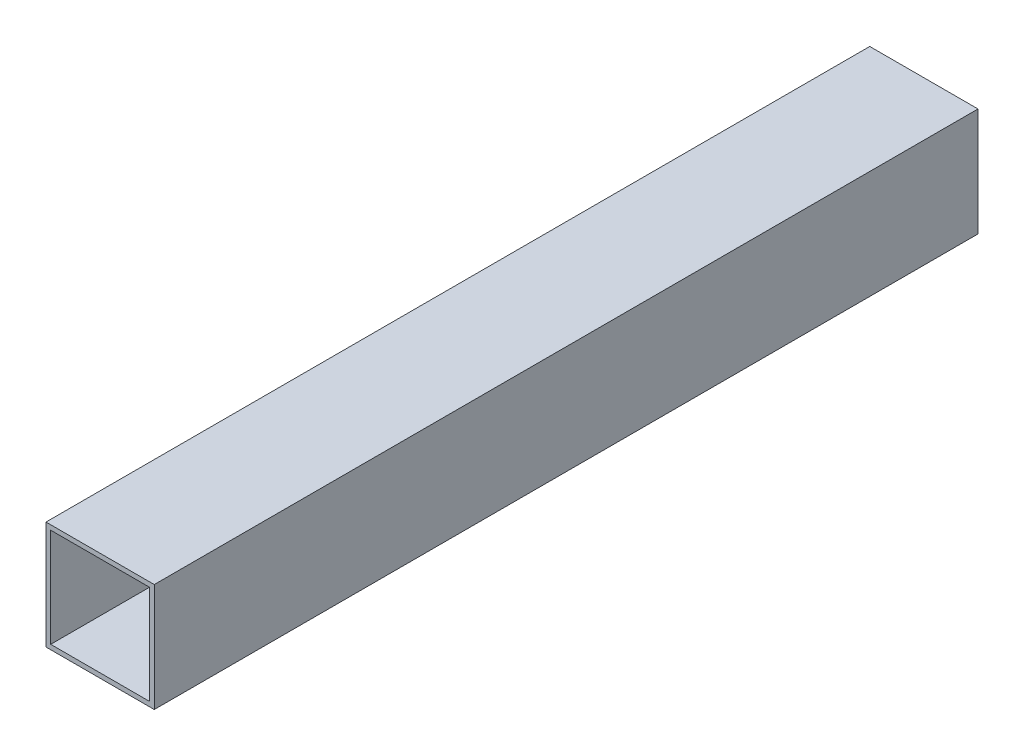
ISO-10303-21;
HEADER;
FILE_DESCRIPTION(('STEP AP214'),'2;1');
FILE_NAME('part.step','',(''),(''),'','','');
FILE_SCHEMA(('AUTOMOTIVE_DESIGN { 1 0 10303 214 1 1 1 1 }'));
ENDSEC;
DATA;
#1=APPLICATION_CONTEXT('core data for automotive mechanical design processes');
#2=APPLICATION_PROTOCOL_DEFINITION('international standard','automotive_design',2000,#1);
#3=PRODUCT_CONTEXT('',#1,'mechanical');
#4=PRODUCT('Part','Part','',(#3));
#5=PRODUCT_RELATED_PRODUCT_CATEGORY('part','',(#4));
#6=PRODUCT_DEFINITION_FORMATION('','',#4);
#7=PRODUCT_DEFINITION_CONTEXT('part definition',#1,'design');
#8=PRODUCT_DEFINITION('design','',#6,#7);
#9=PRODUCT_DEFINITION_SHAPE('','',#8);
#10=(LENGTH_UNIT() NAMED_UNIT(*) SI_UNIT(.MILLI.,.METRE.));
#11=(NAMED_UNIT(*) PLANE_ANGLE_UNIT() SI_UNIT($,.RADIAN.));
#12=(NAMED_UNIT(*) SI_UNIT($,.STERADIAN.) SOLID_ANGLE_UNIT());
#13=UNCERTAINTY_MEASURE_WITH_UNIT(LENGTH_MEASURE(1.E-05),#10,'distance_accuracy_value','');
#14=(GEOMETRIC_REPRESENTATION_CONTEXT(3) GLOBAL_UNCERTAINTY_ASSIGNED_CONTEXT((#13)) GLOBAL_UNIT_ASSIGNED_CONTEXT((#10,
#11,#12)) REPRESENTATION_CONTEXT('',''));
#15=CARTESIAN_POINT('',(0.,0.,0.));
#16=DIRECTION('',(0.,0.,1.));
#17=DIRECTION('',(1.,0.,0.));
#18=AXIS2_PLACEMENT_3D('',#15,#16,#17);
#19=CARTESIAN_POINT('',(0.,0.,350.));
#20=DIRECTION('',(0.,0.,-1.));
#21=DIRECTION('',(-1.,0.,0.));
#22=AXIS2_PLACEMENT_3D('',#19,#20,#21);
#23=PLANE('',#22);
#24=DIRECTION('',(0.,-1.,0.));
#25=VECTOR('',#24,1.);
#26=CARTESIAN_POINT('',(0.,0.,350.));
#27=LINE('',#26,#25);
#28=CARTESIAN_POINT('',(0.,46.,350.));
#29=VERTEX_POINT('',#28);
#30=CARTESIAN_POINT('',(0.,0.,350.));
#31=VERTEX_POINT('',#30);
#32=EDGE_CURVE('E157',#29,#31,#27,.T.);
#33=ORIENTED_EDGE('',*,*,#32,.T.);
#34=DIRECTION('',(1.,0.,0.));
#35=VECTOR('',#34,1.);
#36=CARTESIAN_POINT('',(0.,0.,350.));
#37=LINE('',#36,#35);
#38=CARTESIAN_POINT('',(46.,0.,350.));
#39=VERTEX_POINT('',#38);
#40=EDGE_CURVE('E161',#31,#39,#37,.T.);
#41=ORIENTED_EDGE('',*,*,#40,.T.);
#42=DIRECTION('',(0.,1.,0.));
#43=VECTOR('',#42,1.);
#44=CARTESIAN_POINT('',(46.,0.,350.));
#45=LINE('',#44,#43);
#46=CARTESIAN_POINT('',(46.,46.,350.));
#47=VERTEX_POINT('',#46);
#48=EDGE_CURVE('E165',#39,#47,#45,.T.);
#49=ORIENTED_EDGE('',*,*,#48,.T.);
#50=DIRECTION('',(-1.,0.,0.));
#51=VECTOR('',#50,1.);
#52=CARTESIAN_POINT('',(0.,46.,350.));
#53=LINE('',#52,#51);
#54=EDGE_CURVE('E168',#47,#29,#53,.T.);
#55=ORIENTED_EDGE('',*,*,#54,.T.);
#56=EDGE_LOOP('',(#33,#41,#49,#55));
#57=FACE_BOUND('',#56,.T.);
#58=DIRECTION('',(1.,0.,0.));
#59=VECTOR('',#58,1.);
#60=CARTESIAN_POINT('',(2.,2.,350.));
#61=LINE('',#60,#59);
#62=CARTESIAN_POINT('',(2.,2.,350.));
#63=VERTEX_POINT('',#62);
#64=CARTESIAN_POINT('',(44.,2.,350.));
#65=VERTEX_POINT('',#64);
#66=EDGE_CURVE('E109',#63,#65,#61,.T.);
#67=ORIENTED_EDGE('',*,*,#66,.F.);
#68=DIRECTION('',(0.,-1.,0.));
#69=VECTOR('',#68,1.);
#70=CARTESIAN_POINT('',(2.,2.,350.));
#71=LINE('',#70,#69);
#72=CARTESIAN_POINT('',(2.,44.,350.));
#73=VERTEX_POINT('',#72);
#74=EDGE_CURVE('E135',#73,#63,#71,.T.);
#75=ORIENTED_EDGE('',*,*,#74,.F.);
#76=DIRECTION('',(-1.,0.,0.));
#77=VECTOR('',#76,1.);
#78=CARTESIAN_POINT('',(2.,44.,350.));
#79=LINE('',#78,#77);
#80=CARTESIAN_POINT('',(44.,44.,350.));
#81=VERTEX_POINT('',#80);
#82=EDGE_CURVE('E131',#81,#73,#79,.T.);
#83=ORIENTED_EDGE('',*,*,#82,.F.);
#84=DIRECTION('',(0.,1.,0.));
#85=VECTOR('',#84,1.);
#86=CARTESIAN_POINT('',(44.,2.,350.));
#87=LINE('',#86,#85);
#88=EDGE_CURVE('E118',#65,#81,#87,.T.);
#89=ORIENTED_EDGE('',*,*,#88,.F.);
#90=EDGE_LOOP('',(#67,#75,#83,#89));
#91=FACE_BOUND('',#90,.T.);
#92=ADVANCED_FACE('F43',(#57,#91),#23,.F.);
#93=CARTESIAN_POINT('',(0.,0.,0.));
#94=DIRECTION('',(0.,0.,-1.));
#95=DIRECTION('',(-1.,0.,0.));
#96=AXIS2_PLACEMENT_3D('',#93,#94,#95);
#97=PLANE('',#96);
#98=DIRECTION('',(0.,-1.,0.));
#99=VECTOR('',#98,1.);
#100=CARTESIAN_POINT('',(0.,0.,0.));
#101=LINE('',#100,#99);
#102=CARTESIAN_POINT('',(0.,46.,0.));
#103=VERTEX_POINT('',#102);
#104=CARTESIAN_POINT('',(0.,0.,0.));
#105=VERTEX_POINT('',#104);
#106=EDGE_CURVE('E127',#103,#105,#101,.T.);
#107=ORIENTED_EDGE('',*,*,#106,.F.);
#108=DIRECTION('',(-1.,0.,0.));
#109=VECTOR('',#108,1.);
#110=CARTESIAN_POINT('',(0.,46.,0.));
#111=LINE('',#110,#109);
#112=CARTESIAN_POINT('',(46.,46.,0.));
#113=VERTEX_POINT('',#112);
#114=EDGE_CURVE('E162',#113,#103,#111,.T.);
#115=ORIENTED_EDGE('',*,*,#114,.F.);
#116=DIRECTION('',(0.,1.,0.));
#117=VECTOR('',#116,1.);
#118=CARTESIAN_POINT('',(46.,0.,0.));
#119=LINE('',#118,#117);
#120=CARTESIAN_POINT('',(46.,0.,0.));
#121=VERTEX_POINT('',#120);
#122=EDGE_CURVE('E178',#121,#113,#119,.T.);
#123=ORIENTED_EDGE('',*,*,#122,.F.);
#124=DIRECTION('',(1.,0.,0.));
#125=VECTOR('',#124,1.);
#126=CARTESIAN_POINT('',(0.,0.,0.));
#127=LINE('',#126,#125);
#128=EDGE_CURVE('E175',#105,#121,#127,.T.);
#129=ORIENTED_EDGE('',*,*,#128,.F.);
#130=EDGE_LOOP('',(#107,#115,#123,#129));
#131=FACE_BOUND('',#130,.T.);
#132=DIRECTION('',(0.,-1.,0.));
#133=VECTOR('',#132,1.);
#134=CARTESIAN_POINT('',(2.,2.,0.));
#135=LINE('',#134,#133);
#136=CARTESIAN_POINT('',(2.,44.,0.));
#137=VERTEX_POINT('',#136);
#138=CARTESIAN_POINT('',(2.,2.,0.));
#139=VERTEX_POINT('',#138);
#140=EDGE_CURVE('E119',#137,#139,#135,.T.);
#141=ORIENTED_EDGE('',*,*,#140,.T.);
#142=DIRECTION('',(1.,0.,0.));
#143=VECTOR('',#142,1.);
#144=CARTESIAN_POINT('',(2.,2.,0.));
#145=LINE('',#144,#143);
#146=CARTESIAN_POINT('',(44.,2.,0.));
#147=VERTEX_POINT('',#146);
#148=EDGE_CURVE('E67',#139,#147,#145,.T.);
#149=ORIENTED_EDGE('',*,*,#148,.T.);
#150=DIRECTION('',(0.,1.,0.));
#151=VECTOR('',#150,1.);
#152=CARTESIAN_POINT('',(44.,2.,0.));
#153=LINE('',#152,#151);
#154=CARTESIAN_POINT('',(44.,44.,0.));
#155=VERTEX_POINT('',#154);
#156=EDGE_CURVE('E125',#147,#155,#153,.T.);
#157=ORIENTED_EDGE('',*,*,#156,.T.);
#158=DIRECTION('',(-1.,0.,0.));
#159=VECTOR('',#158,1.);
#160=CARTESIAN_POINT('',(2.,44.,0.));
#161=LINE('',#160,#159);
#162=EDGE_CURVE('E144',#155,#137,#161,.T.);
#163=ORIENTED_EDGE('',*,*,#162,.T.);
#164=EDGE_LOOP('',(#141,#149,#157,#163));
#165=FACE_BOUND('',#164,.T.);
#166=ADVANCED_FACE('F201',(#131,#165),#97,.T.);
#167=CARTESIAN_POINT('',(0.,0.,350.));
#168=DIRECTION('',(1.,0.,0.));
#169=DIRECTION('',(0.,0.,-1.));
#170=AXIS2_PLACEMENT_3D('',#167,#168,#169);
#171=PLANE('',#170);
#172=ORIENTED_EDGE('',*,*,#106,.T.);
#173=DIRECTION('',(0.,0.,-1.));
#174=VECTOR('',#173,1.);
#175=CARTESIAN_POINT('',(0.,0.,350.));
#176=LINE('',#175,#174);
#177=EDGE_CURVE('E11',#31,#105,#176,.T.);
#178=ORIENTED_EDGE('',*,*,#177,.F.);
#179=ORIENTED_EDGE('',*,*,#32,.F.);
#180=DIRECTION('',(0.,0.,-1.));
#181=VECTOR('',#180,1.);
#182=CARTESIAN_POINT('',(0.,46.,350.));
#183=LINE('',#182,#181);
#184=EDGE_CURVE('E171',#29,#103,#183,.T.);
#185=ORIENTED_EDGE('',*,*,#184,.T.);
#186=EDGE_LOOP('',(#172,#178,#179,#185));
#187=FACE_BOUND('',#186,.T.);
#188=ADVANCED_FACE('F45',(#187),#171,.F.);
#189=CARTESIAN_POINT('',(0.,0.,350.));
#190=DIRECTION('',(0.,1.,0.));
#191=DIRECTION('',(0.,0.,1.));
#192=AXIS2_PLACEMENT_3D('',#189,#190,#191);
#193=PLANE('',#192);
#194=ORIENTED_EDGE('',*,*,#128,.T.);
#195=DIRECTION('',(0.,0.,-1.));
#196=VECTOR('',#195,1.);
#197=CARTESIAN_POINT('',(46.,0.,350.));
#198=LINE('',#197,#196);
#199=EDGE_CURVE('E52',#39,#121,#198,.T.);
#200=ORIENTED_EDGE('',*,*,#199,.F.);
#201=ORIENTED_EDGE('',*,*,#40,.F.);
#202=ORIENTED_EDGE('',*,*,#177,.T.);
#203=EDGE_LOOP('',(#194,#200,#201,#202));
#204=FACE_BOUND('',#203,.T.);
#205=ADVANCED_FACE('F211',(#204),#193,.F.);
#206=CARTESIAN_POINT('',(46.,0.,350.));
#207=DIRECTION('',(-1.,0.,0.));
#208=DIRECTION('',(0.,0.,1.));
#209=AXIS2_PLACEMENT_3D('',#206,#207,#208);
#210=PLANE('',#209);
#211=ORIENTED_EDGE('',*,*,#122,.T.);
#212=DIRECTION('',(0.,0.,-1.));
#213=VECTOR('',#212,1.);
#214=CARTESIAN_POINT('',(46.,46.,350.));
#215=LINE('',#214,#213);
#216=EDGE_CURVE('E186',#47,#113,#215,.T.);
#217=ORIENTED_EDGE('',*,*,#216,.F.);
#218=ORIENTED_EDGE('',*,*,#48,.F.);
#219=ORIENTED_EDGE('',*,*,#199,.T.);
#220=EDGE_LOOP('',(#211,#217,#218,#219));
#221=FACE_BOUND('',#220,.T.);
#222=ADVANCED_FACE('F195',(#221),#210,.F.);
#223=CARTESIAN_POINT('',(0.,46.,350.));
#224=DIRECTION('',(0.,-1.,0.));
#225=DIRECTION('',(0.,0.,-1.));
#226=AXIS2_PLACEMENT_3D('',#223,#224,#225);
#227=PLANE('',#226);
#228=ORIENTED_EDGE('',*,*,#114,.T.);
#229=ORIENTED_EDGE('',*,*,#184,.F.);
#230=ORIENTED_EDGE('',*,*,#54,.F.);
#231=ORIENTED_EDGE('',*,*,#216,.T.);
#232=EDGE_LOOP('',(#228,#229,#230,#231));
#233=FACE_BOUND('',#232,.T.);
#234=ADVANCED_FACE('F205',(#233),#227,.F.);
#235=CARTESIAN_POINT('',(2.,2.,350.));
#236=DIRECTION('',(0.,1.,0.));
#237=DIRECTION('',(0.,0.,1.));
#238=AXIS2_PLACEMENT_3D('',#235,#236,#237);
#239=PLANE('',#238);
#240=ORIENTED_EDGE('',*,*,#148,.F.);
#241=DIRECTION('',(0.,0.,-1.));
#242=VECTOR('',#241,1.);
#243=CARTESIAN_POINT('',(2.,2.,350.));
#244=LINE('',#243,#242);
#245=EDGE_CURVE('E113',#63,#139,#244,.T.);
#246=ORIENTED_EDGE('',*,*,#245,.F.);
#247=ORIENTED_EDGE('',*,*,#66,.T.);
#248=DIRECTION('',(0.,0.,-1.));
#249=VECTOR('',#248,1.);
#250=CARTESIAN_POINT('',(44.,2.,350.));
#251=LINE('',#250,#249);
#252=EDGE_CURVE('E112',#65,#147,#251,.T.);
#253=ORIENTED_EDGE('',*,*,#252,.T.);
#254=EDGE_LOOP('',(#240,#246,#247,#253));
#255=FACE_BOUND('',#254,.T.);
#256=ADVANCED_FACE('F111',(#255),#239,.T.);
#257=CARTESIAN_POINT('',(44.,2.,350.));
#258=DIRECTION('',(-1.,0.,0.));
#259=DIRECTION('',(0.,0.,1.));
#260=AXIS2_PLACEMENT_3D('',#257,#258,#259);
#261=PLANE('',#260);
#262=ORIENTED_EDGE('',*,*,#156,.F.);
#263=ORIENTED_EDGE('',*,*,#252,.F.);
#264=ORIENTED_EDGE('',*,*,#88,.T.);
#265=DIRECTION('',(0.,0.,-1.));
#266=VECTOR('',#265,1.);
#267=CARTESIAN_POINT('',(44.,44.,350.));
#268=LINE('',#267,#266);
#269=EDGE_CURVE('E128',#81,#155,#268,.T.);
#270=ORIENTED_EDGE('',*,*,#269,.T.);
#271=EDGE_LOOP('',(#262,#263,#264,#270));
#272=FACE_BOUND('',#271,.T.);
#273=ADVANCED_FACE('F122',(#272),#261,.T.);
#274=CARTESIAN_POINT('',(2.,44.,350.));
#275=DIRECTION('',(0.,-1.,0.));
#276=DIRECTION('',(0.,0.,-1.));
#277=AXIS2_PLACEMENT_3D('',#274,#275,#276);
#278=PLANE('',#277);
#279=ORIENTED_EDGE('',*,*,#162,.F.);
#280=ORIENTED_EDGE('',*,*,#269,.F.);
#281=ORIENTED_EDGE('',*,*,#82,.T.);
#282=DIRECTION('',(0.,0.,-1.));
#283=VECTOR('',#282,1.);
#284=CARTESIAN_POINT('',(2.,44.,350.));
#285=LINE('',#284,#283);
#286=EDGE_CURVE('E59',#73,#137,#285,.T.);
#287=ORIENTED_EDGE('',*,*,#286,.T.);
#288=EDGE_LOOP('',(#279,#280,#281,#287));
#289=FACE_BOUND('',#288,.T.);
#290=ADVANCED_FACE('F234',(#289),#278,.T.);
#291=CARTESIAN_POINT('',(2.,2.,350.));
#292=DIRECTION('',(1.,0.,0.));
#293=DIRECTION('',(0.,0.,-1.));
#294=AXIS2_PLACEMENT_3D('',#291,#292,#293);
#295=PLANE('',#294);
#296=ORIENTED_EDGE('',*,*,#140,.F.);
#297=ORIENTED_EDGE('',*,*,#286,.F.);
#298=ORIENTED_EDGE('',*,*,#74,.T.);
#299=ORIENTED_EDGE('',*,*,#245,.T.);
#300=EDGE_LOOP('',(#296,#297,#298,#299));
#301=FACE_BOUND('',#300,.T.);
#302=ADVANCED_FACE('F238',(#301),#295,.T.);
#303=CLOSED_SHELL('',(#92,#166,#188,#205,#222,#234,#256,#273,#290,#302));
#304=MANIFOLD_SOLID_BREP('B2',#303);
#305=ADVANCED_BREP_SHAPE_REPRESENTATION('',(#18,#304),#14);
#306=SHAPE_DEFINITION_REPRESENTATION(#9,#305);
ENDSEC;
END-ISO-10303-21;
